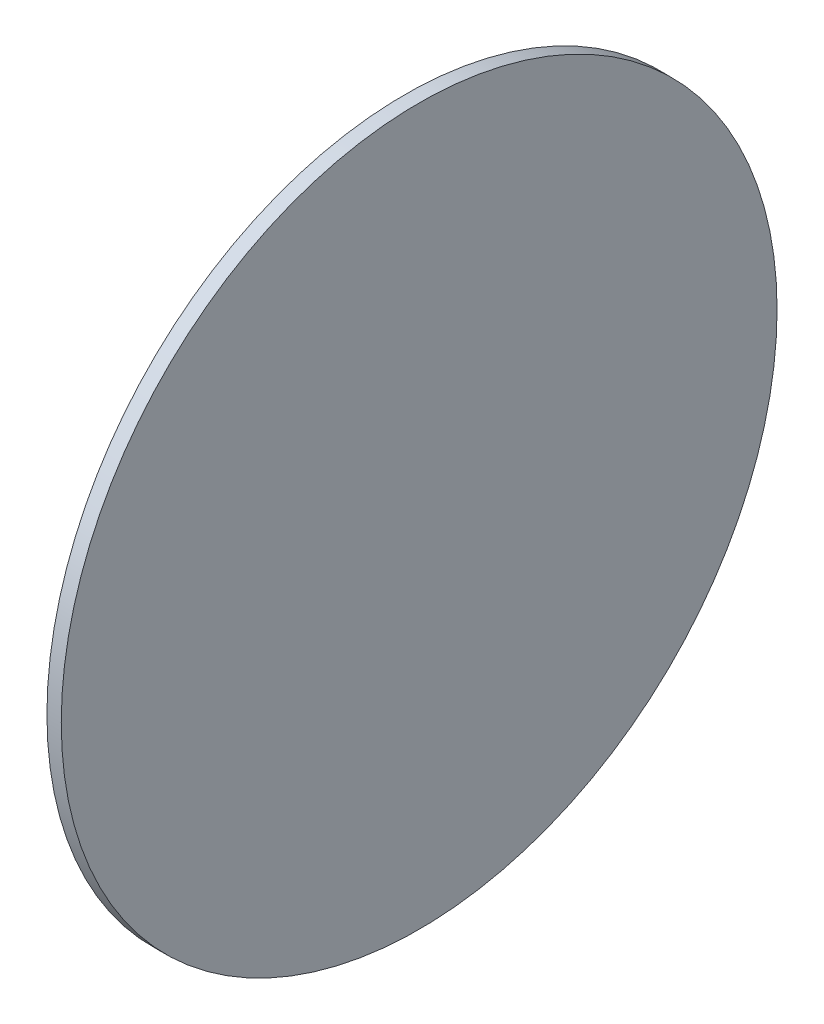
ISO-10303-21;
HEADER;
FILE_DESCRIPTION(('STEP AP214'),'2;1');
FILE_NAME('part.step','',(''),(''),'','','');
FILE_SCHEMA(('AUTOMOTIVE_DESIGN { 1 0 10303 214 1 1 1 1 }'));
ENDSEC;
DATA;
#1=APPLICATION_CONTEXT('core data for automotive mechanical design processes');
#2=APPLICATION_PROTOCOL_DEFINITION('international standard','automotive_design',2000,#1);
#3=PRODUCT_CONTEXT('',#1,'mechanical');
#4=PRODUCT('Part','Part','',(#3));
#5=PRODUCT_RELATED_PRODUCT_CATEGORY('part','',(#4));
#6=PRODUCT_DEFINITION_FORMATION('','',#4);
#7=PRODUCT_DEFINITION_CONTEXT('part definition',#1,'design');
#8=PRODUCT_DEFINITION('design','',#6,#7);
#9=PRODUCT_DEFINITION_SHAPE('','',#8);
#10=(LENGTH_UNIT() NAMED_UNIT(*) SI_UNIT(.MILLI.,.METRE.));
#11=(NAMED_UNIT(*) PLANE_ANGLE_UNIT() SI_UNIT($,.RADIAN.));
#12=(NAMED_UNIT(*) SI_UNIT($,.STERADIAN.) SOLID_ANGLE_UNIT());
#13=UNCERTAINTY_MEASURE_WITH_UNIT(LENGTH_MEASURE(1.E-05),#10,'distance_accuracy_value','');
#14=(GEOMETRIC_REPRESENTATION_CONTEXT(3) GLOBAL_UNCERTAINTY_ASSIGNED_CONTEXT((#13)) GLOBAL_UNIT_ASSIGNED_CONTEXT((#10,
#11,#12)) REPRESENTATION_CONTEXT('',''));
#15=CARTESIAN_POINT('',(0.,0.,0.));
#16=DIRECTION('',(0.,0.,1.));
#17=DIRECTION('',(1.,0.,0.));
#18=AXIS2_PLACEMENT_3D('',#15,#16,#17);
#19=CARTESIAN_POINT('',(20.,0.,0.));
#20=DIRECTION('',(-1.,0.,0.));
#21=DIRECTION('',(0.,0.,1.));
#22=AXIS2_PLACEMENT_3D('',#19,#20,#21);
#23=CYLINDRICAL_SURFACE('',#22,500.);
#24=CARTESIAN_POINT('',(20.,0.,0.));
#25=DIRECTION('',(1.,0.,0.));
#26=DIRECTION('',(0.,0.,-1.));
#27=AXIS2_PLACEMENT_3D('',#24,#25,#26);
#28=CIRCLE('',#27,500.);
#29=CARTESIAN_POINT('',(20.,0.,-500.));
#30=VERTEX_POINT('',#29);
#31=EDGE_CURVE('E10',#30,#30,#28,.T.);
#32=ORIENTED_EDGE('',*,*,#31,.F.);
#33=EDGE_LOOP('',(#32));
#34=FACE_BOUND('',#33,.T.);
#35=CARTESIAN_POINT('',(0.,0.,0.));
#36=DIRECTION('',(1.,0.,0.));
#37=DIRECTION('',(0.,0.,-1.));
#38=AXIS2_PLACEMENT_3D('',#35,#36,#37);
#39=CIRCLE('',#38,500.);
#40=CARTESIAN_POINT('',(0.,0.,-500.));
#41=VERTEX_POINT('',#40);
#42=EDGE_CURVE('E35',#41,#41,#39,.T.);
#43=ORIENTED_EDGE('',*,*,#42,.T.);
#44=EDGE_LOOP('',(#43));
#45=FACE_BOUND('',#44,.T.);
#46=ADVANCED_FACE('F32',(#34,#45),#23,.T.);
#47=CARTESIAN_POINT('',(20.,0.,0.));
#48=DIRECTION('',(1.,0.,0.));
#49=DIRECTION('',(0.,0.,-1.));
#50=AXIS2_PLACEMENT_3D('',#47,#48,#49);
#51=PLANE('',#50);
#52=ORIENTED_EDGE('',*,*,#31,.T.);
#53=EDGE_LOOP('',(#52));
#54=FACE_BOUND('',#53,.T.);
#55=ADVANCED_FACE('F47',(#54),#51,.T.);
#56=CARTESIAN_POINT('',(0.,0.,0.));
#57=DIRECTION('',(1.,0.,0.));
#58=DIRECTION('',(0.,0.,-1.));
#59=AXIS2_PLACEMENT_3D('',#56,#57,#58);
#60=PLANE('',#59);
#61=ORIENTED_EDGE('',*,*,#42,.F.);
#62=EDGE_LOOP('',(#61));
#63=FACE_BOUND('',#62,.T.);
#64=ADVANCED_FACE('F45',(#63),#60,.F.);
#65=CLOSED_SHELL('',(#46,#55,#64));
#66=MANIFOLD_SOLID_BREP('B2',#65);
#67=ADVANCED_BREP_SHAPE_REPRESENTATION('',(#18,#66),#14);
#68=SHAPE_DEFINITION_REPRESENTATION(#9,#67);
ENDSEC;
END-ISO-10303-21;
